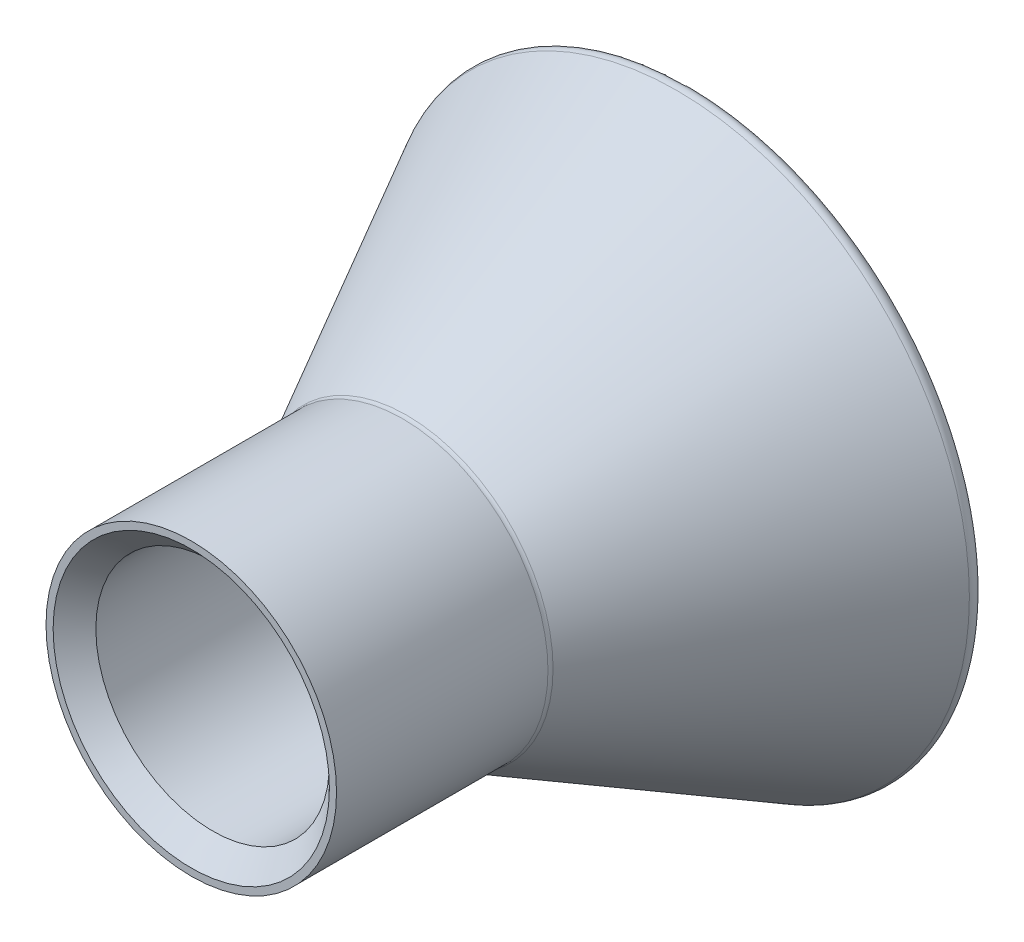
ISO-10303-21;
HEADER;
FILE_DESCRIPTION(('STEP AP214'),'2;1');
FILE_NAME('part.step','',(''),(''),'','','');
FILE_SCHEMA(('AUTOMOTIVE_DESIGN { 1 0 10303 214 1 1 1 1 }'));
ENDSEC;
DATA;
#1=APPLICATION_CONTEXT('core data for automotive mechanical design processes');
#2=APPLICATION_PROTOCOL_DEFINITION('international standard','automotive_design',2000,#1);
#3=PRODUCT_CONTEXT('',#1,'mechanical');
#4=PRODUCT('Part','Part','',(#3));
#5=PRODUCT_RELATED_PRODUCT_CATEGORY('part','',(#4));
#6=PRODUCT_DEFINITION_FORMATION('','',#4);
#7=PRODUCT_DEFINITION_CONTEXT('part definition',#1,'design');
#8=PRODUCT_DEFINITION('design','',#6,#7);
#9=PRODUCT_DEFINITION_SHAPE('','',#8);
#10=(LENGTH_UNIT() NAMED_UNIT(*) SI_UNIT(.MILLI.,.METRE.));
#11=(NAMED_UNIT(*) PLANE_ANGLE_UNIT() SI_UNIT($,.RADIAN.));
#12=(NAMED_UNIT(*) SI_UNIT($,.STERADIAN.) SOLID_ANGLE_UNIT());
#13=UNCERTAINTY_MEASURE_WITH_UNIT(LENGTH_MEASURE(1.E-05),#10,'distance_accuracy_value','');
#14=(GEOMETRIC_REPRESENTATION_CONTEXT(3) GLOBAL_UNCERTAINTY_ASSIGNED_CONTEXT((#13)) GLOBAL_UNIT_ASSIGNED_CONTEXT((#10,
#11,#12)) REPRESENTATION_CONTEXT('',''));
#15=CARTESIAN_POINT('',(0.,0.,0.));
#16=DIRECTION('',(0.,0.,1.));
#17=DIRECTION('',(1.,0.,0.));
#18=AXIS2_PLACEMENT_3D('',#15,#16,#17);
#19=CARTESIAN_POINT('',(0.,1.04083408558609E-13,-20.));
#20=DIRECTION('',(0.,0.,-1.));
#21=DIRECTION('',(-1.,0.,0.));
#22=AXIS2_PLACEMENT_3D('',#19,#20,#21);
#23=PLANE('',#22);
#24=CARTESIAN_POINT('',(0.,0.,-20.));
#25=DIRECTION('',(0.,0.,-1.));
#26=DIRECTION('',(-1.,0.,0.));
#27=AXIS2_PLACEMENT_3D('',#24,#25,#26);
#28=CIRCLE('',#27,19.9941085130316);
#29=CARTESIAN_POINT('',(-19.9941085130316,0.,-20.));
#30=VERTEX_POINT('',#29);
#31=EDGE_CURVE('E69',#30,#30,#28,.T.);
#32=ORIENTED_EDGE('',*,*,#31,.T.);
#33=EDGE_LOOP('',(#32));
#34=FACE_BOUND('',#33,.T.);
#35=CARTESIAN_POINT('',(0.,0.,-20.));
#36=DIRECTION('',(0.,0.,-1.));
#37=DIRECTION('',(-1.,0.,0.));
#38=AXIS2_PLACEMENT_3D('',#35,#36,#37);
#39=CIRCLE('',#38,19.3578914869684);
#40=CARTESIAN_POINT('',(-19.3578914869684,0.,-20.));
#41=VERTEX_POINT('',#40);
#42=EDGE_CURVE('E73',#41,#41,#39,.F.);
#43=ORIENTED_EDGE('',*,*,#42,.T.);
#44=EDGE_LOOP('',(#43));
#45=FACE_BOUND('',#44,.T.);
#46=ADVANCED_FACE('F41',(#34,#45),#23,.T.);
#47=CARTESIAN_POINT('',(0.,0.,-20.));
#48=DIRECTION('',(0.,0.,-1.));
#49=DIRECTION('',(-1.,0.,0.));
#50=AXIS2_PLACEMENT_3D('',#47,#48,#49);
#51=CONICAL_SURFACE('',#50,19.,0.495133263468404);
#52=CARTESIAN_POINT('',(0.,0.,-0.133438447047558));
#53=DIRECTION('',(0.,0.,-1.));
#54=DIRECTION('',(-1.,0.,0.));
#55=AXIS2_PLACEMENT_3D('',#52,#53,#54);
#56=CIRCLE('',#55,8.27205676140568);
#57=CARTESIAN_POINT('',(-8.27205676140568,0.,-0.133438447047558));
#58=VERTEX_POINT('',#57);
#59=EDGE_CURVE('E49',#58,#58,#56,.F.);
#60=ORIENTED_EDGE('',*,*,#59,.T.);
#61=EDGE_LOOP('',(#60));
#62=FACE_BOUND('',#61,.T.);
#63=CARTESIAN_POINT('',(0.,0.,-19.6850893488409));
#64=DIRECTION('',(0.,0.,1.));
#65=DIRECTION('',(1.,0.,0.));
#66=AXIS2_PLACEMENT_3D('',#63,#64,#65);
#67=CIRCLE('',#66,18.8299482483741);
#68=CARTESIAN_POINT('',(18.8299482483741,0.,-19.6850893488409));
#69=VERTEX_POINT('',#68);
#70=EDGE_CURVE('E65',#69,#69,#67,.F.);
#71=ORIENTED_EDGE('',*,*,#70,.T.);
#72=EDGE_LOOP('',(#71));
#73=FACE_BOUND('',#72,.T.);
#74=ADVANCED_FACE('F112',(#62,#73),#51,.F.);
#75=CARTESIAN_POINT('',(0.,0.,0.));
#76=DIRECTION('',(0.,0.,-1.));
#77=DIRECTION('',(-1.,0.,0.));
#78=AXIS2_PLACEMENT_3D('',#75,#76,#77);
#79=CONICAL_SURFACE('',#78,10.2,0.495133263468404);
#80=CARTESIAN_POINT('',(0.,0.,-0.133438447047558));
#81=DIRECTION('',(0.,0.,1.));
#82=DIRECTION('',(1.,0.,0.));
#83=AXIS2_PLACEMENT_3D('',#80,#81,#82);
#84=CIRCLE('',#83,10.2720567614057);
#85=CARTESIAN_POINT('',(10.2720567614057,0.,-0.133438447047558));
#86=VERTEX_POINT('',#85);
#87=EDGE_CURVE('E54',#86,#86,#84,.F.);
#88=ORIENTED_EDGE('',*,*,#87,.T.);
#89=EDGE_LOOP('',(#88));
#90=FACE_BOUND('',#89,.T.);
#91=CARTESIAN_POINT('',(0.,0.,-19.1149106511591));
#92=DIRECTION('',(0.,0.,1.));
#93=DIRECTION('',(1.,0.,0.));
#94=AXIS2_PLACEMENT_3D('',#91,#92,#93);
#95=CIRCLE('',#94,20.5220517516259);
#96=CARTESIAN_POINT('',(20.5220517516259,0.,-19.1149106511591));
#97=VERTEX_POINT('',#96);
#98=EDGE_CURVE('E77',#97,#97,#95,.T.);
#99=ORIENTED_EDGE('',*,*,#98,.T.);
#100=EDGE_LOOP('',(#99));
#101=FACE_BOUND('',#100,.T.);
#102=ADVANCED_FACE('F101',(#90,#101),#79,.T.);
#103=CARTESIAN_POINT('',(0.,10.2,15.));
#104=DIRECTION('',(0.,0.,-1.));
#105=DIRECTION('',(-1.,0.,0.));
#106=AXIS2_PLACEMENT_3D('',#103,#104,#105);
#107=PLANE('',#106);
#108=CARTESIAN_POINT('',(0.,0.,15.));
#109=DIRECTION('',(0.,0.,-1.));
#110=DIRECTION('',(-1.,0.,0.));
#111=AXIS2_PLACEMENT_3D('',#108,#109,#110);
#112=CIRCLE('',#111,9.69999999999999);
#113=CARTESIAN_POINT('',(-9.69999999999999,0.,15.));
#114=VERTEX_POINT('',#113);
#115=EDGE_CURVE('E81',#114,#114,#112,.T.);
#116=ORIENTED_EDGE('',*,*,#115,.T.);
#117=EDGE_LOOP('',(#116));
#118=FACE_BOUND('',#117,.T.);
#119=CARTESIAN_POINT('',(0.,0.,15.));
#120=DIRECTION('',(0.,0.,1.));
#121=DIRECTION('',(1.,0.,0.));
#122=AXIS2_PLACEMENT_3D('',#119,#120,#121);
#123=CIRCLE('',#122,10.2);
#124=CARTESIAN_POINT('',(10.2,0.,15.));
#125=VERTEX_POINT('',#124);
#126=EDGE_CURVE('E89',#125,#125,#123,.T.);
#127=ORIENTED_EDGE('',*,*,#126,.T.);
#128=EDGE_LOOP('',(#127));
#129=FACE_BOUND('',#128,.T.);
#130=ADVANCED_FACE('F94',(#118,#129),#107,.F.);
#131=CARTESIAN_POINT('',(0.,0.,15.));
#132=DIRECTION('',(0.,0.,1.));
#133=DIRECTION('',(1.,0.,0.));
#134=AXIS2_PLACEMENT_3D('',#131,#132,#133);
#135=CYLINDRICAL_SURFACE('',#134,10.2);
#136=CARTESIAN_POINT('',(0.,0.,0.151650901793374));
#137=DIRECTION('',(0.,0.,1.));
#138=DIRECTION('',(1.,0.,0.));
#139=AXIS2_PLACEMENT_3D('',#136,#137,#138);
#140=CIRCLE('',#139,10.2);
#141=CARTESIAN_POINT('',(10.2,0.,0.151650901793374));
#142=VERTEX_POINT('',#141);
#143=EDGE_CURVE('E59',#142,#142,#140,.T.);
#144=ORIENTED_EDGE('',*,*,#143,.T.);
#145=EDGE_LOOP('',(#144));
#146=FACE_BOUND('',#145,.T.);
#147=ORIENTED_EDGE('',*,*,#126,.F.);
#148=EDGE_LOOP('',(#147));
#149=FACE_BOUND('',#148,.T.);
#150=ADVANCED_FACE('F96',(#146,#149),#135,.T.);
#151=CARTESIAN_POINT('',(0.,0.,-25.));
#152=DIRECTION('',(0.,0.,1.));
#153=DIRECTION('',(1.,0.,0.));
#154=AXIS2_PLACEMENT_3D('',#151,#152,#153);
#155=CYLINDRICAL_SURFACE('',#154,8.2);
#156=CARTESIAN_POINT('',(0.,0.,0.151650901793372));
#157=DIRECTION('',(0.,0.,-1.));
#158=DIRECTION('',(-1.,0.,0.));
#159=AXIS2_PLACEMENT_3D('',#156,#157,#158);
#160=CIRCLE('',#159,8.2);
#161=CARTESIAN_POINT('',(-8.2,0.,0.151650901793372));
#162=VERTEX_POINT('',#161);
#163=EDGE_CURVE('E10',#162,#162,#160,.T.);
#164=ORIENTED_EDGE('',*,*,#163,.T.);
#165=EDGE_LOOP('',(#164));
#166=FACE_BOUND('',#165,.T.);
#167=CARTESIAN_POINT('',(0.,0.,13.5));
#168=DIRECTION('',(0.,0.,-1.));
#169=DIRECTION('',(-1.,0.,0.));
#170=AXIS2_PLACEMENT_3D('',#167,#168,#169);
#171=CIRCLE('',#170,8.2);
#172=CARTESIAN_POINT('',(-8.2,0.,13.5));
#173=VERTEX_POINT('',#172);
#174=EDGE_CURVE('E85',#173,#173,#171,.F.);
#175=ORIENTED_EDGE('',*,*,#174,.T.);
#176=EDGE_LOOP('',(#175));
#177=FACE_BOUND('',#176,.T.);
#178=ADVANCED_FACE('F98',(#166,#177),#155,.F.);
#179=CARTESIAN_POINT('',(0.,0.,13.5));
#180=DIRECTION('',(0.,0.,1.));
#181=DIRECTION('',(1.,0.,0.));
#182=AXIS2_PLACEMENT_3D('',#179,#180,#181);
#183=CONICAL_SURFACE('',#182,8.2,0.785398163397448);
#184=ORIENTED_EDGE('',*,*,#115,.F.);
#185=EDGE_LOOP('',(#184));
#186=FACE_BOUND('',#185,.T.);
#187=ORIENTED_EDGE('',*,*,#174,.F.);
#188=EDGE_LOOP('',(#187));
#189=FACE_BOUND('',#188,.T.);
#190=ADVANCED_FACE('F106',(#186,#189),#183,.F.);
#191=CARTESIAN_POINT('',(0.,0.,-19.4));
#192=DIRECTION('',(0.,0.,-1.));
#193=DIRECTION('',(-1.,0.,0.));
#194=AXIS2_PLACEMENT_3D('',#191,#192,#193);
#195=TOROIDAL_SURFACE('',#194,19.9941085130316,0.6);
#196=ORIENTED_EDGE('',*,*,#31,.F.);
#197=EDGE_LOOP('',(#196));
#198=FACE_BOUND('',#197,.T.);
#199=ORIENTED_EDGE('',*,*,#98,.F.);
#200=EDGE_LOOP('',(#199));
#201=FACE_BOUND('',#200,.T.);
#202=ADVANCED_FACE('F129',(#198,#201),#195,.T.);
#203=CARTESIAN_POINT('',(0.,0.,-19.4));
#204=DIRECTION('',(0.,0.,-1.));
#205=DIRECTION('',(-1.,0.,0.));
#206=AXIS2_PLACEMENT_3D('',#203,#204,#205);
#207=TOROIDAL_SURFACE('',#206,19.3578914869684,0.6);
#208=ORIENTED_EDGE('',*,*,#70,.F.);
#209=EDGE_LOOP('',(#208));
#210=FACE_BOUND('',#209,.T.);
#211=ORIENTED_EDGE('',*,*,#42,.F.);
#212=EDGE_LOOP('',(#211));
#213=FACE_BOUND('',#212,.T.);
#214=ADVANCED_FACE('F126',(#210,#213),#207,.T.);
#215=CARTESIAN_POINT('',(0.,0.,0.151650901793374));
#216=DIRECTION('',(0.,0.,1.));
#217=DIRECTION('',(1.,0.,0.));
#218=AXIS2_PLACEMENT_3D('',#215,#216,#217);
#219=TOROIDAL_SURFACE('',#218,10.8,0.6);
#220=ORIENTED_EDGE('',*,*,#87,.F.);
#221=EDGE_LOOP('',(#220));
#222=FACE_BOUND('',#221,.T.);
#223=ORIENTED_EDGE('',*,*,#143,.F.);
#224=EDGE_LOOP('',(#223));
#225=FACE_BOUND('',#224,.T.);
#226=ADVANCED_FACE('F128',(#222,#225),#219,.F.);
#227=CARTESIAN_POINT('',(0.,0.,0.151650901793372));
#228=DIRECTION('',(0.,0.,-1.));
#229=DIRECTION('',(-1.,0.,0.));
#230=AXIS2_PLACEMENT_3D('',#227,#228,#229);
#231=TOROIDAL_SURFACE('',#230,8.8,0.6);
#232=ORIENTED_EDGE('',*,*,#163,.F.);
#233=EDGE_LOOP('',(#232));
#234=FACE_BOUND('',#233,.T.);
#235=ORIENTED_EDGE('',*,*,#59,.F.);
#236=EDGE_LOOP('',(#235));
#237=FACE_BOUND('',#236,.T.);
#238=ADVANCED_FACE('F43',(#234,#237),#231,.T.);
#239=CLOSED_SHELL('',(#46,#74,#102,#130,#150,#178,#190,#202,#214,#226,#238));
#240=MANIFOLD_SOLID_BREP('B2',#239);
#241=ADVANCED_BREP_SHAPE_REPRESENTATION('',(#18,#240),#14);
#242=SHAPE_DEFINITION_REPRESENTATION(#9,#241);
ENDSEC;
END-ISO-10303-21;
